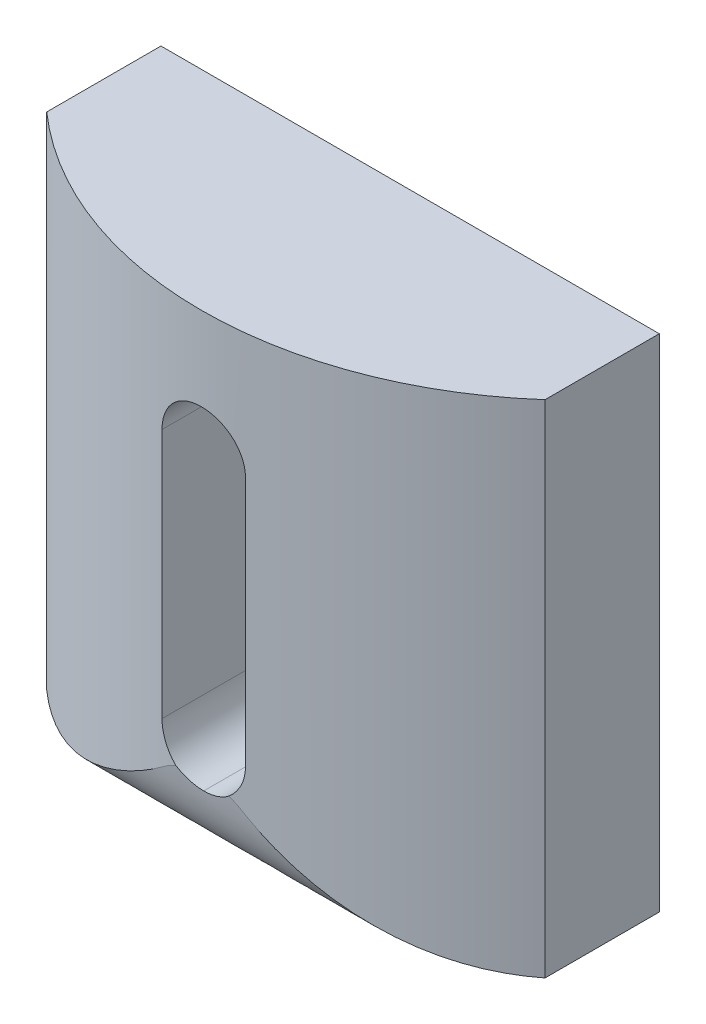
ISO-10303-21;
HEADER;
FILE_DESCRIPTION(('STEP AP214'),'2;1');
FILE_NAME('part.step','',(''),(''),'','','');
FILE_SCHEMA(('AUTOMOTIVE_DESIGN { 1 0 10303 214 1 1 1 1 }'));
ENDSEC;
DATA;
#1=APPLICATION_CONTEXT('core data for automotive mechanical design processes');
#2=APPLICATION_PROTOCOL_DEFINITION('international standard','automotive_design',2000,#1);
#3=PRODUCT_CONTEXT('',#1,'mechanical');
#4=PRODUCT('Part','Part','',(#3));
#5=PRODUCT_RELATED_PRODUCT_CATEGORY('part','',(#4));
#6=PRODUCT_DEFINITION_FORMATION('','',#4);
#7=PRODUCT_DEFINITION_CONTEXT('part definition',#1,'design');
#8=PRODUCT_DEFINITION('design','',#6,#7);
#9=PRODUCT_DEFINITION_SHAPE('','',#8);
#10=(LENGTH_UNIT() NAMED_UNIT(*) SI_UNIT(.MILLI.,.METRE.));
#11=(NAMED_UNIT(*) PLANE_ANGLE_UNIT() SI_UNIT($,.RADIAN.));
#12=(NAMED_UNIT(*) SI_UNIT($,.STERADIAN.) SOLID_ANGLE_UNIT());
#13=UNCERTAINTY_MEASURE_WITH_UNIT(LENGTH_MEASURE(1.E-05),#10,'distance_accuracy_value','');
#14=(GEOMETRIC_REPRESENTATION_CONTEXT(3) GLOBAL_UNCERTAINTY_ASSIGNED_CONTEXT((#13)) GLOBAL_UNIT_ASSIGNED_CONTEXT((#10,
#11,#12)) REPRESENTATION_CONTEXT('',''));
#15=CARTESIAN_POINT('',(0.,0.,0.));
#16=DIRECTION('',(0.,0.,1.));
#17=DIRECTION('',(1.,0.,0.));
#18=AXIS2_PLACEMENT_3D('',#15,#16,#17);
#19=CARTESIAN_POINT('',(0.,0.,12.5));
#20=DIRECTION('',(0.,1.,0.));
#21=DIRECTION('',(0.,0.,1.));
#22=AXIS2_PLACEMENT_3D('',#19,#20,#21);
#23=PLANE('',#22);
#24=DIRECTION('',(0.,0.,-1.));
#25=VECTOR('',#24,1.);
#26=CARTESIAN_POINT('',(29.85,0.,12.5));
#27=LINE('',#26,#25);
#28=CARTESIAN_POINT('',(29.85,0.,6.84257539707056));
#29=VERTEX_POINT('',#28);
#30=CARTESIAN_POINT('',(29.85,0.,0.));
#31=VERTEX_POINT('',#30);
#32=EDGE_CURVE('E129',#29,#31,#27,.T.);
#33=ORIENTED_EDGE('',*,*,#32,.F.);
#34=DIRECTION('',(1.,0.,0.));
#35=VECTOR('',#34,1.);
#36=CARTESIAN_POINT('',(0.,0.,6.84257539707056));
#37=LINE('',#36,#35);
#38=CARTESIAN_POINT('',(0.,0.,6.84257539707056));
#39=VERTEX_POINT('',#38);
#40=EDGE_CURVE('E117',#39,#29,#37,.T.);
#41=ORIENTED_EDGE('',*,*,#40,.F.);
#42=DIRECTION('',(0.,0.,-1.));
#43=VECTOR('',#42,1.);
#44=CARTESIAN_POINT('',(0.,0.,12.5));
#45=LINE('',#44,#43);
#46=CARTESIAN_POINT('',(0.,0.,0.));
#47=VERTEX_POINT('',#46);
#48=EDGE_CURVE('E127',#39,#47,#45,.T.);
#49=ORIENTED_EDGE('',*,*,#48,.T.);
#50=DIRECTION('',(1.,0.,0.));
#51=VECTOR('',#50,1.);
#52=CARTESIAN_POINT('',(0.,0.,0.));
#53=LINE('',#52,#51);
#54=EDGE_CURVE('E192',#47,#31,#53,.T.);
#55=ORIENTED_EDGE('',*,*,#54,.T.);
#56=EDGE_LOOP('',(#33,#41,#49,#55));
#57=FACE_BOUND('',#56,.T.);
#58=ADVANCED_FACE('F33',(#57),#23,.F.);
#59=CARTESIAN_POINT('',(0.,30.,12.5));
#60=DIRECTION('',(0.,-1.,0.));
#61=DIRECTION('',(0.,0.,-1.));
#62=AXIS2_PLACEMENT_3D('',#59,#60,#61);
#63=PLANE('',#62);
#64=DIRECTION('',(0.,0.,-1.));
#65=VECTOR('',#64,1.);
#66=CARTESIAN_POINT('',(0.,30.,12.5));
#67=LINE('',#66,#65);
#68=CARTESIAN_POINT('',(0.,30.,6.84257539707056));
#69=VERTEX_POINT('',#68);
#70=CARTESIAN_POINT('',(0.,30.,0.));
#71=VERTEX_POINT('',#70);
#72=EDGE_CURVE('E200',#69,#71,#67,.T.);
#73=ORIENTED_EDGE('',*,*,#72,.F.);
#74=CARTESIAN_POINT('',(14.925,30.,-10.015728977273));
#75=DIRECTION('',(0.,1.,0.));
#76=DIRECTION('',(0.,0.,1.));
#77=AXIS2_PLACEMENT_3D('',#74,#75,#76);
#78=CIRCLE('',#77,22.515728977273);
#79=CARTESIAN_POINT('',(29.85,30.,6.84257539707056));
#80=VERTEX_POINT('',#79);
#81=EDGE_CURVE('E130',#69,#80,#78,.T.);
#82=ORIENTED_EDGE('',*,*,#81,.T.);
#83=DIRECTION('',(0.,0.,-1.));
#84=VECTOR('',#83,1.);
#85=CARTESIAN_POINT('',(29.85,30.,12.5));
#86=LINE('',#85,#84);
#87=CARTESIAN_POINT('',(29.85,30.,0.));
#88=VERTEX_POINT('',#87);
#89=EDGE_CURVE('E147',#80,#88,#86,.T.);
#90=ORIENTED_EDGE('',*,*,#89,.T.);
#91=DIRECTION('',(-1.,0.,0.));
#92=VECTOR('',#91,1.);
#93=CARTESIAN_POINT('',(0.,30.,0.));
#94=LINE('',#93,#92);
#95=EDGE_CURVE('E197',#88,#71,#94,.T.);
#96=ORIENTED_EDGE('',*,*,#95,.T.);
#97=EDGE_LOOP('',(#73,#82,#90,#96));
#98=FACE_BOUND('',#97,.T.);
#99=ADVANCED_FACE('F203',(#98),#63,.F.);
#100=CARTESIAN_POINT('',(0.,0.,12.5));
#101=DIRECTION('',(1.,0.,0.));
#102=DIRECTION('',(0.,0.,-1.));
#103=AXIS2_PLACEMENT_3D('',#100,#101,#102);
#104=PLANE('',#103);
#105=ORIENTED_EDGE('',*,*,#48,.F.);
#106=DIRECTION('',(0.,-1.,0.));
#107=VECTOR('',#106,1.);
#108=CARTESIAN_POINT('',(0.,30.,6.84257539707056));
#109=LINE('',#108,#107);
#110=EDGE_CURVE('E134',#69,#39,#109,.T.);
#111=ORIENTED_EDGE('',*,*,#110,.F.);
#112=ORIENTED_EDGE('',*,*,#72,.T.);
#113=DIRECTION('',(0.,-1.,0.));
#114=VECTOR('',#113,1.);
#115=CARTESIAN_POINT('',(0.,0.,0.));
#116=LINE('',#115,#114);
#117=EDGE_CURVE('E144',#71,#47,#116,.T.);
#118=ORIENTED_EDGE('',*,*,#117,.T.);
#119=EDGE_LOOP('',(#105,#111,#112,#118));
#120=FACE_BOUND('',#119,.T.);
#121=ADVANCED_FACE('F142',(#120),#104,.F.);
#122=CARTESIAN_POINT('',(29.85,0.,12.5));
#123=DIRECTION('',(-1.,0.,0.));
#124=DIRECTION('',(0.,0.,1.));
#125=AXIS2_PLACEMENT_3D('',#122,#123,#124);
#126=PLANE('',#125);
#127=ORIENTED_EDGE('',*,*,#89,.F.);
#128=DIRECTION('',(0.,-1.,0.));
#129=VECTOR('',#128,1.);
#130=CARTESIAN_POINT('',(29.85,30.,6.84257539707056));
#131=LINE('',#130,#129);
#132=EDGE_CURVE('E139',#80,#29,#131,.T.);
#133=ORIENTED_EDGE('',*,*,#132,.T.);
#134=ORIENTED_EDGE('',*,*,#32,.T.);
#135=DIRECTION('',(0.,1.,0.));
#136=VECTOR('',#135,1.);
#137=CARTESIAN_POINT('',(29.85,0.,0.));
#138=LINE('',#137,#136);
#139=EDGE_CURVE('E194',#31,#88,#138,.T.);
#140=ORIENTED_EDGE('',*,*,#139,.T.);
#141=EDGE_LOOP('',(#127,#133,#134,#140));
#142=FACE_BOUND('',#141,.T.);
#143=ADVANCED_FACE('F207',(#142),#126,.F.);
#144=CARTESIAN_POINT('',(0.,0.,0.));
#145=DIRECTION('',(0.,0.,-1.));
#146=DIRECTION('',(-1.,0.,0.));
#147=AXIS2_PLACEMENT_3D('',#144,#145,#146);
#148=PLANE('',#147);
#149=CARTESIAN_POINT('',(14.925,22.5,0.));
#150=DIRECTION('',(0.,0.,-1.));
#151=DIRECTION('',(-1.,0.,0.));
#152=AXIS2_PLACEMENT_3D('',#149,#150,#151);
#153=CIRCLE('',#152,2.5);
#154=CARTESIAN_POINT('',(17.425,22.5,0.));
#155=VERTEX_POINT('',#154);
#156=CARTESIAN_POINT('',(14.925,25.,0.));
#157=VERTEX_POINT('',#156);
#158=EDGE_CURVE('E273',#155,#157,#153,.F.);
#159=ORIENTED_EDGE('',*,*,#158,.T.);
#160=CARTESIAN_POINT('',(14.925,22.5,0.));
#161=DIRECTION('',(0.,0.,-1.));
#162=DIRECTION('',(-1.,0.,0.));
#163=AXIS2_PLACEMENT_3D('',#160,#161,#162);
#164=CIRCLE('',#163,2.5);
#165=CARTESIAN_POINT('',(12.425,22.5,0.));
#166=VERTEX_POINT('',#165);
#167=EDGE_CURVE('E11',#157,#166,#164,.F.);
#168=ORIENTED_EDGE('',*,*,#167,.T.);
#169=DIRECTION('',(0.,-1.,0.));
#170=VECTOR('',#169,1.);
#171=CARTESIAN_POINT('',(12.425,25.,0.));
#172=LINE('',#171,#170);
#173=CARTESIAN_POINT('',(12.425,7.5,0.));
#174=VERTEX_POINT('',#173);
#175=EDGE_CURVE('E185',#166,#174,#172,.T.);
#176=ORIENTED_EDGE('',*,*,#175,.T.);
#177=CARTESIAN_POINT('',(14.925,7.5,0.));
#178=DIRECTION('',(0.,0.,-1.));
#179=DIRECTION('',(-1.,0.,0.));
#180=AXIS2_PLACEMENT_3D('',#177,#178,#179);
#181=CIRCLE('',#180,2.5);
#182=CARTESIAN_POINT('',(14.925,5.,0.));
#183=VERTEX_POINT('',#182);
#184=EDGE_CURVE('E251',#174,#183,#181,.F.);
#185=ORIENTED_EDGE('',*,*,#184,.T.);
#186=CARTESIAN_POINT('',(14.925,7.5,0.));
#187=DIRECTION('',(0.,0.,-1.));
#188=DIRECTION('',(-1.,0.,0.));
#189=AXIS2_PLACEMENT_3D('',#186,#187,#188);
#190=CIRCLE('',#189,2.5);
#191=CARTESIAN_POINT('',(17.425,7.5,0.));
#192=VERTEX_POINT('',#191);
#193=EDGE_CURVE('E265',#183,#192,#190,.F.);
#194=ORIENTED_EDGE('',*,*,#193,.T.);
#195=DIRECTION('',(0.,1.,0.));
#196=VECTOR('',#195,1.);
#197=CARTESIAN_POINT('',(17.425,25.,0.));
#198=LINE('',#197,#196);
#199=EDGE_CURVE('E188',#192,#155,#198,.T.);
#200=ORIENTED_EDGE('',*,*,#199,.T.);
#201=EDGE_LOOP('',(#159,#168,#176,#185,#194,#200));
#202=FACE_BOUND('',#201,.T.);
#203=ORIENTED_EDGE('',*,*,#117,.F.);
#204=ORIENTED_EDGE('',*,*,#95,.F.);
#205=ORIENTED_EDGE('',*,*,#139,.F.);
#206=ORIENTED_EDGE('',*,*,#54,.F.);
#207=EDGE_LOOP('',(#203,#204,#205,#206));
#208=FACE_BOUND('',#207,.T.);
#209=ADVANCED_FACE('F209',(#202,#208),#148,.T.);
#210=CARTESIAN_POINT('',(12.425,25.,0.));
#211=DIRECTION('',(-1.,0.,0.));
#212=DIRECTION('',(0.,0.,1.));
#213=AXIS2_PLACEMENT_3D('',#210,#211,#212);
#214=PLANE('',#213);
#215=DIRECTION('',(0.,-1.,0.));
#216=VECTOR('',#215,1.);
#217=CARTESIAN_POINT('',(12.425,30.,12.3607777067027));
#218=LINE('',#217,#216);
#219=CARTESIAN_POINT('',(12.425,22.5,12.3607777067027));
#220=VERTEX_POINT('',#219);
#221=CARTESIAN_POINT('',(12.425,7.5,12.3607777067027));
#222=VERTEX_POINT('',#221);
#223=EDGE_CURVE('E182',#220,#222,#218,.T.);
#224=ORIENTED_EDGE('',*,*,#223,.T.);
#225=DIRECTION('',(0.,0.,1.));
#226=VECTOR('',#225,1.);
#227=CARTESIAN_POINT('',(12.425,7.5,0.));
#228=LINE('',#227,#226);
#229=EDGE_CURVE('E295',#222,#174,#228,.F.);
#230=ORIENTED_EDGE('',*,*,#229,.T.);
#231=ORIENTED_EDGE('',*,*,#175,.F.);
#232=DIRECTION('',(0.,0.,1.));
#233=VECTOR('',#232,1.);
#234=CARTESIAN_POINT('',(12.425,22.5,12.3607777067027));
#235=LINE('',#234,#233);
#236=EDGE_CURVE('E121',#166,#220,#235,.T.);
#237=ORIENTED_EDGE('',*,*,#236,.T.);
#238=EDGE_LOOP('',(#224,#230,#231,#237));
#239=FACE_BOUND('',#238,.T.);
#240=ADVANCED_FACE('F211',(#239),#214,.F.);
#241=CARTESIAN_POINT('',(17.425,25.,0.));
#242=DIRECTION('',(1.,0.,0.));
#243=DIRECTION('',(0.,1.,0.));
#244=AXIS2_PLACEMENT_3D('',#241,#242,#243);
#245=PLANE('',#244);
#246=ORIENTED_EDGE('',*,*,#199,.F.);
#247=DIRECTION('',(0.,0.,1.));
#248=VECTOR('',#247,1.);
#249=CARTESIAN_POINT('',(17.425,7.5,12.3607777067027));
#250=LINE('',#249,#248);
#251=CARTESIAN_POINT('',(17.425,7.5,12.3607777067027));
#252=VERTEX_POINT('',#251);
#253=EDGE_CURVE('E294',#192,#252,#250,.T.);
#254=ORIENTED_EDGE('',*,*,#253,.T.);
#255=DIRECTION('',(0.,-1.,0.));
#256=VECTOR('',#255,1.);
#257=CARTESIAN_POINT('',(17.425,30.,12.3607777067027));
#258=LINE('',#257,#256);
#259=CARTESIAN_POINT('',(17.425,22.5,12.3607777067027));
#260=VERTEX_POINT('',#259);
#261=EDGE_CURVE('E179',#252,#260,#258,.F.);
#262=ORIENTED_EDGE('',*,*,#261,.T.);
#263=DIRECTION('',(0.,0.,1.));
#264=VECTOR('',#263,1.);
#265=CARTESIAN_POINT('',(17.425,22.5,0.));
#266=LINE('',#265,#264);
#267=EDGE_CURVE('E287',#260,#155,#266,.F.);
#268=ORIENTED_EDGE('',*,*,#267,.T.);
#269=EDGE_LOOP('',(#246,#254,#262,#268));
#270=FACE_BOUND('',#269,.T.);
#271=ADVANCED_FACE('F218',(#270),#245,.F.);
#272=CARTESIAN_POINT('',(14.925,30.,-10.015728977273));
#273=DIRECTION('',(0.,-1.,0.));
#274=DIRECTION('',(0.,0.,-1.));
#275=AXIS2_PLACEMENT_3D('',#272,#273,#274);
#276=CYLINDRICAL_SURFACE('',#275,22.515728977273);
#277=ORIENTED_EDGE('',*,*,#110,.T.);
#278=CARTESIAN_POINT('',(-2.58472636347347,-0.166773320827684,4.1393949732367));
#279=CARTESIAN_POINT('',(-2.45410962545879,-0.156805067942879,4.30096748757149));
#280=CARTESIAN_POINT('',(-2.32125298040341,-0.14694822163917,4.46073425650512));
#281=CARTESIAN_POINT('',(-2.05119337624261,-0.127466955344592,4.77650046362552));
#282=CARTESIAN_POINT('',(-1.91399144721932,-0.117842481207548,4.93250077945197));
#283=CARTESIAN_POINT('',(-1.63532956844886,-0.0988319903611336,5.24063630061295));
#284=CARTESIAN_POINT('',(-1.49387012052692,-0.0894459457871693,5.39277195759935));
#285=CARTESIAN_POINT('',(-1.27837860910716,-0.0755387431261878,5.61818981556341));
#286=CARTESIAN_POINT('',(-1.20590216984145,-0.0709258191980508,5.69295938779569));
#287=CARTESIAN_POINT('',(-1.05991636155013,-0.0617622835624684,5.84148840374407));
#288=CARTESIAN_POINT('',(-0.986406991421458,-0.0572116719215762,5.91524784638129));
#289=CARTESIAN_POINT('',(-0.838362618930134,-0.0481732709104207,6.06174895158061));
#290=CARTESIAN_POINT('',(-0.763827512106805,-0.0436854880339171,6.13449050893731));
#291=CARTESIAN_POINT('',(-0.613753018913467,-0.0347739290024925,6.27893433320267));
#292=CARTESIAN_POINT('',(-0.538213635548716,-0.030350152656117,6.35063660322001));
#293=CARTESIAN_POINT('',(-0.424155152816031,-0.023763126941059,6.45740674229894));
#294=CARTESIAN_POINT('',(-0.386006746453019,-0.021575332921694,6.49286989577749));
#295=CARTESIAN_POINT('',(-0.309464222663843,-0.0172155275645243,6.56353108293002));
#296=CARTESIAN_POINT('',(-0.271070105426475,-0.0150435162145955,6.59872911680767));
#297=CARTESIAN_POINT('',(-0.194037643789323,-0.010718126564865,6.66885867571665));
#298=CARTESIAN_POINT('',(-0.15539929756492,-0.00856474840455604,6.7037901987526));
#299=CARTESIAN_POINT('',(-0.0972604915295719,-0.00534097706670996,6.7559858844427));
#300=CARTESIAN_POINT('',(-0.0778506433359544,-0.00426743419607127,6.7733508746218));
#301=CARTESIAN_POINT('',(-0.0389703205852642,-0.00213567207549544,6.80801382571111));
#302=CARTESIAN_POINT('',(-0.019499845995766,-0.00107745283375576,6.82531178658545));
#303=CARTESIAN_POINT('',(0.0180680442623334,0.000998339448172658,6.85857140434365));
#304=CARTESIAN_POINT('',(0.0361613050166557,0.00201319168141877,6.87453792047468));
#305=CARTESIAN_POINT('',(0.0723963072505063,0.00412586844651311,6.90641028321091));
#306=CARTESIAN_POINT('',(0.0905380486581804,0.00522369285545239,6.92231612990595));
#307=CARTESIAN_POINT('',(0.145035856645974,0.00862339209468691,6.9699426130187));
#308=CARTESIAN_POINT('',(0.181464776237177,0.0110315077130629,7.00157243083197));
#309=CARTESIAN_POINT('',(0.254512494736611,0.0161412888347708,7.06458642882731));
#310=CARTESIAN_POINT('',(0.291131289255312,0.0188429475805306,7.09597061464618));
#311=CARTESIAN_POINT('',(0.364556699359893,0.0245379562649379,7.15849203524776));
#312=CARTESIAN_POINT('',(0.401363315971417,0.027531307798056,7.18962926867955));
#313=CARTESIAN_POINT('',(0.512041505479065,0.0369491787811233,7.2826514950309));
#314=CARTESIAN_POINT('',(0.586190385191508,0.0438128407255969,7.34416337531421));
#315=CARTESIAN_POINT('',(0.73520169571206,0.0587150050329768,7.46617448652288));
#316=CARTESIAN_POINT('',(0.810064142054956,0.0667535330283031,7.52667369532235));
#317=CARTESIAN_POINT('',(0.960463454472547,0.0840073229129021,7.64663273018456));
#318=CARTESIAN_POINT('',(1.03600020869519,0.0932223928946934,7.70609272396096));
#319=CARTESIAN_POINT('',(1.18773133227829,0.112832155756057,7.82396639461329));
#320=CARTESIAN_POINT('',(1.26392569500386,0.123226836746866,7.88238008202761));
#321=CARTESIAN_POINT('',(1.49344735642436,0.156181641879347,8.05602387518693));
#322=CARTESIAN_POINT('',(1.64772793533411,0.180514213459288,8.16966843966551));
#323=CARTESIAN_POINT('',(1.95851582504007,0.233890846508653,8.39255426177924));
#324=CARTESIAN_POINT('',(2.11502202408954,0.262932626167091,8.5017976201392));
#325=CARTESIAN_POINT('',(2.43015834690951,0.325731004607929,8.7158827919752));
#326=CARTESIAN_POINT('',(2.58878910576317,0.359489042981351,8.820723248753));
#327=CARTESIAN_POINT('',(2.90793113306912,0.43169218395995,9.0259123388558));
#328=CARTESIAN_POINT('',(3.06844282291947,0.470138355755566,9.12625994036518));
#329=CARTESIAN_POINT('',(3.39109648381558,0.551673524066099,9.32238805699535));
#330=CARTESIAN_POINT('',(3.55323866403019,0.594763123337911,9.41816797685824));
#331=CARTESIAN_POINT('',(3.91110125345408,0.694501023057601,9.62358489874503));
#332=CARTESIAN_POINT('',(4.10712205370183,0.752145635092225,9.73221734820239));
#333=CARTESIAN_POINT('',(4.5007281344738,0.873890849470155,9.94278861540799));
#334=CARTESIAN_POINT('',(4.69831333093838,0.937991107072695,10.044727790107));
#335=CARTESIAN_POINT('',(5.09465532036718,1.07250878717622,10.2418957944017));
#336=CARTESIAN_POINT('',(5.29341202082371,1.14292571696363,10.3371251463447));
#337=CARTESIAN_POINT('',(5.69169649073698,1.28991491512458,10.5208785566397));
#338=CARTESIAN_POINT('',(5.89122411547407,1.36648607701522,10.6094038148013));
#339=CARTESIAN_POINT('',(6.29045303368255,1.52552416984341,10.7796956053758));
#340=CARTESIAN_POINT('',(6.49015373846146,1.60798308274544,10.8614710143734));
#341=CARTESIAN_POINT('',(6.88965187680597,1.77872027039568,11.0184644992205));
#342=CARTESIAN_POINT('',(7.08944931346688,1.86699874552389,11.0936823490717));
#343=CARTESIAN_POINT('',(7.4888446115931,2.04922331448201,11.2376641252193));
#344=CARTESIAN_POINT('',(7.68844241459959,2.14317074537623,11.3064265190984));
#345=CARTESIAN_POINT('',(8.08714270863749,2.33658693477774,11.4376114485872));
#346=CARTESIAN_POINT('',(8.2862449977385,2.43605764956445,11.5000317154551));
#347=CARTESIAN_POINT('',(8.62039839316594,2.60786406429057,11.5997758574368));
#348=CARTESIAN_POINT('',(8.7556893157424,2.67877303249714,11.6387694953954));
#349=CARTESIAN_POINT('',(9.02574719268075,2.82303062088067,11.7138938476289));
#350=CARTESIAN_POINT('',(9.16051419924011,2.89637899068291,11.7500248544382));
#351=CARTESIAN_POINT('',(9.42938938643479,3.04546597334375,11.8194625277183));
#352=CARTESIAN_POINT('',(9.56349777297239,3.121203775867,11.8527701378637));
#353=CARTESIAN_POINT('',(9.83091679975785,3.27503107554338,11.9166045354289));
#354=CARTESIAN_POINT('',(9.96422786110896,3.35311916982887,11.9471329395874));
#355=CARTESIAN_POINT('',(10.2299031644803,3.51162390568147,12.0054562124617));
#356=CARTESIAN_POINT('',(10.3622681118056,3.59203852240242,12.0332533708158));
#357=CARTESIAN_POINT('',(10.6260802252436,3.75531867026217,12.0862041274237));
#358=CARTESIAN_POINT('',(10.7575270367019,3.83818509005702,12.1113567517454));
#359=CARTESIAN_POINT('',(11.0192919642689,4.00641096730091,12.1590583248697));
#360=CARTESIAN_POINT('',(11.1496101055654,4.09177036892868,12.1816073319148));
#361=CARTESIAN_POINT('',(11.3441066343877,4.22180454260657,12.2135214570234));
#362=CARTESIAN_POINT('',(11.4087905924286,4.26549238026185,12.2238434898755));
#363=CARTESIAN_POINT('',(11.5377889656856,4.35355790585421,12.2438557578735));
#364=CARTESIAN_POINT('',(11.6021033705891,4.39793561291555,12.2535459754657));
#365=CARTESIAN_POINT('',(11.7303863402542,4.48746352995986,12.2723104543757));
#366=CARTESIAN_POINT('',(11.7943544626274,4.53261451389816,12.2813840472309));
#367=CARTESIAN_POINT('',(11.9218186312122,4.62368906378223,12.2989095105476));
#368=CARTESIAN_POINT('',(11.9853147081834,4.6696125787403,12.3073614218443));
#369=CARTESIAN_POINT('',(12.0802131528461,4.73917273608251,12.3195851974895));
#370=CARTESIAN_POINT('',(12.1118175270517,4.76249389480834,12.3235876106331));
#371=CARTESIAN_POINT('',(12.1748804803158,4.80935713004554,12.3314387052446));
#372=CARTESIAN_POINT('',(12.2063390620472,4.83289920248257,12.3352873895409));
#373=CARTESIAN_POINT('',(12.2690981630329,4.88022318365276,12.3428317115121));
#374=CARTESIAN_POINT('',(12.3003986681798,4.90400511324324,12.3465273357321));
#375=CARTESIAN_POINT('',(12.3472272000787,4.93985552408306,12.3519572123523));
#376=CARTESIAN_POINT('',(12.3628165177557,4.95183538545921,12.3537482644889));
#377=CARTESIAN_POINT('',(12.393936775159,4.97587663302867,12.3572908446724));
#378=CARTESIAN_POINT('',(12.4094677145269,4.98793801972132,12.3590423724771));
#379=CARTESIAN_POINT('',(12.4321523597471,5.00555434178477,12.3615767993208));
#380=CARTESIAN_POINT('',(12.439305004929,5.01110880943647,12.362372458172));
#381=CARTESIAN_POINT('',(12.4536401156537,5.02217959364444,12.363960109549));
#382=CARTESIAN_POINT('',(12.4608225810018,5.02769591044898,12.3647521020988));
#383=CARTESIAN_POINT('',(12.4824038450954,5.0442008395671,12.3671212658894));
#384=CARTESIAN_POINT('',(12.4968368675489,5.05514570722479,12.3686916630143));
#385=CARTESIAN_POINT('',(12.5257990305189,5.0769070965024,12.3718143927379));
#386=CARTESIAN_POINT('',(12.5403281611926,5.08772363095775,12.3733667271428));
#387=CARTESIAN_POINT('',(12.5694834854834,5.10922830930857,12.3764528781024));
#388=CARTESIAN_POINT('',(12.5841096811434,5.11991645048822,12.3779866942654));
#389=CARTESIAN_POINT('',(12.6280749999095,5.15173869911663,12.3825534142431));
#390=CARTESIAN_POINT('',(12.6575604082916,5.1726754073136,12.3855580150347));
#391=CARTESIAN_POINT('',(12.7169282593843,5.21399506996568,12.3914877303454));
#392=CARTESIAN_POINT('',(12.7468107360831,5.23437797655609,12.3944128379941));
#393=CARTESIAN_POINT('',(12.8069182744244,5.27452082859793,12.4001736582057));
#394=CARTESIAN_POINT('',(12.8371425837336,5.29428187636388,12.4030095289505));
#395=CARTESIAN_POINT('',(12.897990206733,5.33318887734258,12.4085929981427));
#396=CARTESIAN_POINT('',(12.9286135043865,5.35233485517062,12.4113406001226));
#397=CARTESIAN_POINT('',(13.0210064073616,5.40875368521015,12.4194371568479));
#398=CARTESIAN_POINT('',(13.0833817888672,5.44506289191725,12.4246478210388));
#399=CARTESIAN_POINT('',(13.2095352554624,5.51471495595898,12.4346434541133));
#400=CARTESIAN_POINT('',(13.2733080950354,5.54806711249651,12.4394297575084));
#401=CARTESIAN_POINT('',(13.4025886693169,5.61172703771231,12.4485654701535));
#402=CARTESIAN_POINT('',(13.4681003214081,5.64202703517475,12.4529137641716));
#403=CARTESIAN_POINT('',(13.6010317983456,5.69934607246809,12.4611395083104));
#404=CARTESIAN_POINT('',(13.6684604883864,5.72634505837608,12.4650140805314));
#405=CARTESIAN_POINT('',(13.805407367659,5.77678539729607,12.4722526759604));
#406=CARTESIAN_POINT('',(13.8749395020636,5.80018958888963,12.4756113662053));
#407=CARTESIAN_POINT('',(13.9451398298271,5.82149363070567,12.478668668028));
#408=B_SPLINE_CURVE_WITH_KNOTS('',3,(#278,#279,#280,#281,#282,#283,#284,#285,#286,#287,#288,
#289,#290,#291,#292,#293,#294,#295,#296,#297,#298,#299,#300,#301,#302,#303,#304,#305,#306,#307,
#308,#309,#310,#311,#312,#313,#314,#315,#316,#317,#318,#319,#320,#321,#322,#323,#324,#325,#326,
#327,#328,#329,#330,#331,#332,#333,#334,#335,#336,#337,#338,#339,#340,#341,#342,#343,#344,#345,
#346,#347,#348,#349,#350,#351,#352,#353,#354,#355,#356,#357,#358,#359,#360,#361,#362,#363,#364,
#365,#366,#367,#368,#369,#370,#371,#372,#373,#374,#375,#376,#377,#378,#379,#380,#381,#382,#383,
#384,#385,#386,#387,#388,#389,#390,#391,#392,#393,#394,#395,#396,#397,#398,#399,#400,#401,#402,
#403,#404,#405,#406,#407),.UNSPECIFIED.,.F.,.F.,(4,2,2,2,2,2,2,2,2,2,2,2,2,2,2,2,2,2,2,2,2,2,2,
2,2,2,2,2,2,2,2,2,2,2,2,2,2,2,2,2,2,2,2,2,2,2,2,2,2,2,2,2,2,2,2,2,2,2,2,2,2,2,2,2,4),(0.,
0.623990027760338,1.24783322518938,1.87160317723592,2.18429518380998,2.49698752433141,
2.80971194851714,3.12243543709736,3.27882975067016,3.43522394408929,3.59161930730321,
3.66981724340471,3.74801522133704,3.82047141031475,3.89292749196323,4.0378385755848,
4.18274632395633,4.32765486447669,4.61739670424131,4.90714486633814,5.19684582742349,
5.48654386900357,6.0658833263003,6.6449429033167,7.22417962025854,7.80354868768732,
8.38299305301323,9.07700591678245,9.77098173889746,10.4649034764471,11.1587007301813,
11.8515705457502,12.5444642307847,13.2375219834803,13.930826794254,14.403722292389,
14.8765694024792,15.3492578427648,15.8216695265358,16.2936817408057,16.7658671838397,
17.2380420620912,17.4742415981051,17.710447693657,17.9469058971732,18.1833485550037,
18.301789940601,18.4202291460564,18.5386787410195,18.5979048964455,18.6571314149586,
18.6844042440416,18.7116768954784,18.7662208414077,18.8207592852588,18.8752988806952,
18.9841537498224,19.0930179974679,19.201676944743,19.3103315380233,19.5273411186921,
19.743642072713,19.9604805315688,20.1785769565382,20.3987949030228),.UNSPECIFIED.);
#409=CARTESIAN_POINT('',(13.3291959858264,5.57557552802213,12.4433774369715));
#410=VERTEX_POINT('',#409);
#411=EDGE_CURVE('E59',#39,#410,#408,.T.);
#412=ORIENTED_EDGE('',*,*,#411,.T.);
#413=CARTESIAN_POINT('',(13.3291959858264,5.57557552802212,12.4433774369715));
#414=CARTESIAN_POINT('',(13.2750731652166,5.62044782168111,12.4395322863157));
#415=CARTESIAN_POINT('',(13.2228566217285,5.66760869917295,12.4356249680018));
#416=CARTESIAN_POINT('',(13.1225792025509,5.76615660040246,12.4277969130826));
#417=CARTESIAN_POINT('',(13.074518261255,5.81754355739608,12.4238761766902));
#418=CARTESIAN_POINT('',(12.9828985740779,5.92418804679255,12.4161325090518));
#419=CARTESIAN_POINT('',(12.9393393231884,5.97944514386626,12.4123095668714));
#420=CARTESIAN_POINT('',(12.8570330294392,6.09342265959322,12.4048702328092));
#421=CARTESIAN_POINT('',(12.8182858126551,6.15214295296078,12.4012538334647));
#422=CARTESIAN_POINT('',(12.709630682636,6.33299999129772,12.3908662453807));
#423=CARTESIAN_POINT('',(12.6473045817126,6.45983838381307,12.3845562522219));
#424=CARTESIAN_POINT('',(12.5449440892848,6.72209875370461,12.3739127635545));
#425=CARTESIAN_POINT('',(12.5048829610115,6.85751021743539,12.3695768985617));
#426=CARTESIAN_POINT('',(12.4593696215272,7.07826266576637,12.3645972873945));
#427=CARTESIAN_POINT('',(12.446490637931,7.16211837419539,12.3631710500484));
#428=CARTESIAN_POINT('',(12.4293055616254,7.3306375580559,12.3612589002607));
#429=CARTESIAN_POINT('',(12.4249917483744,7.41530023685,12.3607721409957));
#430=CARTESIAN_POINT('',(12.425,7.5,12.3607777067027));
#431=B_SPLINE_CURVE_WITH_KNOTS('',3,(#413,#414,#415,#416,#417,#418,#419,#420,#421,#422,#423,
#424,#425,#426,#427,#428,#429,#430),.UNSPECIFIED.,.F.,.F.,(4,2,2,2,2,2,2,2,4),(0.,
0.211162098629584,0.422320862938043,0.633455913275937,0.844583330204255,1.26681670934957,
1.68854195025332,1.94268683781393,2.19660253803843),.UNSPECIFIED.);
#432=EDGE_CURVE('E245',#410,#222,#431,.T.);
#433=ORIENTED_EDGE('',*,*,#432,.T.);
#434=ORIENTED_EDGE('',*,*,#223,.F.);
#435=CARTESIAN_POINT('',(12.425,22.5,12.3607777067027));
#436=CARTESIAN_POINT('',(12.4249930098564,22.570086213212,12.3607744610579));
#437=CARTESIAN_POINT('',(12.4279472028724,22.6401689382476,12.3611069170635));
#438=CARTESIAN_POINT('',(12.4397238237075,22.7798286830407,12.3624192477107));
#439=CARTESIAN_POINT('',(12.4485458354313,22.8494057383023,12.363399076446));
#440=CARTESIAN_POINT('',(12.4719921214409,22.987495671886,12.365980868804));
#441=CARTESIAN_POINT('',(12.4866105221571,23.0560095547312,12.3675822026113));
#442=CARTESIAN_POINT('',(12.5215276801244,23.1915377717028,12.3713583204717));
#443=CARTESIAN_POINT('',(12.5418263957475,23.2585521168147,12.3735331003224));
#444=CARTESIAN_POINT('',(12.6110677815176,23.456687047323,12.3808323202869));
#445=CARTESIAN_POINT('',(12.6683679344739,23.5849712036945,12.3867330749389));
#446=CARTESIAN_POINT('',(12.8035261275409,23.8300212168028,12.3999347001015));
#447=CARTESIAN_POINT('',(12.8813825121106,23.9467880000766,12.4072354578469));
#448=CARTESIAN_POINT('',(13.0558228256012,24.1660946073572,12.4224506145685));
#449=CARTESIAN_POINT('',(13.1524774719161,24.2685781183657,12.4303672607863));
#450=CARTESIAN_POINT('',(13.3616340689671,24.4559148927435,12.4459030025947));
#451=CARTESIAN_POINT('',(13.4741390643599,24.5407647611387,12.4535220406585));
#452=CARTESIAN_POINT('',(13.7121648386375,24.6906325599802,12.4676275893509));
#453=CARTESIAN_POINT('',(13.8377214271783,24.7555938898784,12.4741108456784));
#454=CARTESIAN_POINT('',(14.0980191599651,24.863454814295,12.4851837665857));
#455=CARTESIAN_POINT('',(14.2327545512954,24.9063680861866,12.4897746047648));
#456=CARTESIAN_POINT('',(14.4610811630845,24.9583543749797,12.4954045812207));
#457=CARTESIAN_POINT('',(14.5532215476086,24.9739593865647,12.4971193999663));
#458=CARTESIAN_POINT('',(14.7385611928947,24.9947822521097,12.499420588881));
#459=CARTESIAN_POINT('',(14.8317589289535,25.0000135227894,12.5000084165941));
#460=CARTESIAN_POINT('',(14.925,25.,12.5));
#461=B_SPLINE_CURVE_WITH_KNOTS('',3,(#435,#436,#437,#438,#439,#440,#441,#442,#443,#444,#445,
#446,#447,#448,#449,#450,#451,#452,#453,#454,#455,#456,#457,#458,#459,#460),.UNSPECIFIED.,.F.,
.F.,(4,2,2,2,2,2,2,2,2,2,2,2,4),(0.,0.210189393780704,0.420363884321427,0.630325943887181,
0.840286464796636,1.25999206933071,1.67966388226638,2.10094611605048,2.52230938357243,
2.9448608897643,3.36714995134481,3.64700307289951,3.92649401401219),.UNSPECIFIED.);
#462=CARTESIAN_POINT('',(14.925,25.,12.5));
#463=VERTEX_POINT('',#462);
#464=EDGE_CURVE('E43',#220,#463,#461,.T.);
#465=ORIENTED_EDGE('',*,*,#464,.T.);
#466=CARTESIAN_POINT('',(14.925,25.,12.5));
#467=CARTESIAN_POINT('',(14.9950875626848,25.0000069869018,12.5000031673256));
#468=CARTESIAN_POINT('',(15.0651716446866,24.9970526833141,12.4996728113538));
#469=CARTESIAN_POINT('',(15.2048341792079,24.9852755986394,12.4983684609991));
#470=CARTESIAN_POINT('',(15.2744126669805,24.9764532307556,12.4973945119351));
#471=CARTESIAN_POINT('',(15.4125057347669,24.9530059276009,12.494827671498));
#472=CARTESIAN_POINT('',(15.4810213162988,24.9383868489915,12.4932354048707));
#473=CARTESIAN_POINT('',(15.6165529503856,24.9034680072597,12.4894795637985));
#474=CARTESIAN_POINT('',(15.6835690141084,24.8831682864598,12.48731599361));
#475=CARTESIAN_POINT('',(15.8817093579611,24.8139232510944,12.4800517337919));
#476=CARTESIAN_POINT('',(16.0099971462707,24.7566198742052,12.4741760772974));
#477=CARTESIAN_POINT('',(16.2550531257041,24.6214541520213,12.4610173644626));
#478=CARTESIAN_POINT('',(16.3718222599492,24.5435934918326,12.4537344234923));
#479=CARTESIAN_POINT('',(16.591126069476,24.3691488826292,12.4385403078681));
#480=CARTESIAN_POINT('',(16.6936051887496,24.2724951745547,12.4306268594699));
#481=CARTESIAN_POINT('',(16.8809335318215,24.0633422496099,12.4150810595973));
#482=CARTESIAN_POINT('',(16.9657793393797,23.9508399693415,12.4074487628279));
#483=CARTESIAN_POINT('',(17.1156429069162,23.7128165333845,12.3933057134717));
#484=CARTESIAN_POINT('',(17.180603315413,23.5872590948485,12.3867982280201));
#485=CARTESIAN_POINT('',(17.2884622569284,23.3269596151478,12.3756768745504));
#486=CARTESIAN_POINT('',(17.3313744969754,23.1922233394932,12.3710618303901));
#487=CARTESIAN_POINT('',(17.3833578440613,22.9638995862425,12.3654006223455));
#488=CARTESIAN_POINT('',(17.3989615263408,22.8717631830385,12.3636757214512));
#489=CARTESIAN_POINT('',(17.4197826718924,22.6864312931004,12.3613606774379));
#490=CARTESIAN_POINT('',(17.4250135290308,22.5932373286173,12.3607690709909));
#491=CARTESIAN_POINT('',(17.425,22.5,12.3607777067027));
#492=B_SPLINE_CURVE_WITH_KNOTS('',3,(#466,#467,#468,#469,#470,#471,#472,#473,#474,#475,#476,
#477,#478,#479,#480,#481,#482,#483,#484,#485,#486,#487,#488,#489,#490,#491),.UNSPECIFIED.,.F.,
.F.,(4,2,2,2,2,2,2,2,2,2,2,2,4),(0.,0.210193460542016,0.420372121752083,0.630338969470285,
0.840304252907914,1.26002034581525,1.67970204474633,2.10097239769459,2.52232429073533,
2.94488019771266,3.36717308894693,3.6470143296891,3.92649399071756),.UNSPECIFIED.);
#493=EDGE_CURVE('E267',#463,#260,#492,.T.);
#494=ORIENTED_EDGE('',*,*,#493,.T.);
#495=ORIENTED_EDGE('',*,*,#261,.F.);
#496=CARTESIAN_POINT('',(17.425,7.5,12.3607777067027));
#497=CARTESIAN_POINT('',(17.4250070573413,7.4299271754576,12.360774457622));
#498=CARTESIAN_POINT('',(17.4220539535097,7.35985773388066,12.3611067890214));
#499=CARTESIAN_POINT('',(17.4102816165519,7.2202229069205,12.3624186414049));
#500=CARTESIAN_POINT('',(17.401462684899,7.15065749581845,12.3633981291285));
#501=CARTESIAN_POINT('',(17.3780204937228,7.01256559641803,12.3659794884283));
#502=CARTESIAN_POINT('',(17.3634010095251,6.94403846240915,12.3675809551714));
#503=CARTESIAN_POINT('',(17.3284789620601,6.80848474805682,12.3713576024312));
#504=CARTESIAN_POINT('',(17.3081765595155,6.74145812533426,12.3735327667228));
#505=CARTESIAN_POINT('',(17.2389147110259,6.54325928457942,12.3808342099885));
#506=CARTESIAN_POINT('',(17.1815943723575,6.41493149940561,12.3867371715713));
#507=CARTESIAN_POINT('',(17.0463973113247,6.16986896094546,12.3999417651614));
#508=CARTESIAN_POINT('',(16.9685396028249,6.05312362129422,12.4072421017475));
#509=CARTESIAN_POINT('',(16.8279439008655,5.87635108805245,12.4195054813418));
#510=CARTESIAN_POINT('',(16.7708580936583,5.81174240323309,12.4242912076578));
#511=CARTESIAN_POINT('',(16.6504041367223,5.68881677363904,12.4338742666167));
#512=CARTESIAN_POINT('',(16.5870430470601,5.63049290897157,12.4386715804234));
#513=CARTESIAN_POINT('',(16.5208040141736,5.57557552802212,12.4433774369715));
#514=B_SPLINE_CURVE_WITH_KNOTS('',3,(#496,#497,#498,#499,#500,#501,#502,#503,#504,#505,#506,
#507,#508,#509,#510,#511,#512,#513),.UNSPECIFIED.,.F.,.F.,(4,2,2,2,2,2,2,2,4),(0.,
0.210149473897073,0.420288148022831,0.6302902758607,0.840286465083066,1.26016886160512,
1.67966387961581,1.93828360607473,2.19661560566572),.UNSPECIFIED.);
#515=CARTESIAN_POINT('',(16.5208040141736,5.57557552802214,12.4433774369715));
#516=VERTEX_POINT('',#515);
#517=EDGE_CURVE('E253',#252,#516,#514,.T.);
#518=ORIENTED_EDGE('',*,*,#517,.T.);
#519=CARTESIAN_POINT('',(15.9048601701728,5.82149363070568,12.478668668028));
#520=CARTESIAN_POINT('',(15.9750194644923,5.80020203339274,12.4756131520914));
#521=CARTESIAN_POINT('',(16.0445113646463,5.77681274493028,12.4722566005663));
#522=CARTESIAN_POINT('',(16.1813489841731,5.72641778368146,12.4650245171994));
#523=CARTESIAN_POINT('',(16.2487092789215,5.69945095534027,12.4611545598489));
#524=CARTESIAN_POINT('',(16.3814871952444,5.64221158795064,12.4529402489829));
#525=CARTESIAN_POINT('',(16.4469141334703,5.61196012918477,12.448598920658));
#526=CARTESIAN_POINT('',(16.5760194233313,5.54840985421035,12.4394789437101));
#527=CARTESIAN_POINT('',(16.6397019358338,5.5151192952342,12.4347014800663));
#528=CARTESIAN_POINT('',(16.7658345108269,5.44551228517645,12.4247123125896));
#529=CARTESIAN_POINT('',(16.8282753952726,5.40917955478492,12.4194982725428));
#530=CARTESIAN_POINT('',(16.9207663397177,5.35271980107354,12.4113958429761));
#531=CARTESIAN_POINT('',(16.951423325367,5.33355854650839,12.4086460486834));
#532=CARTESIAN_POINT('',(17.0123376097303,5.29461948214189,12.4030579780684));
#533=CARTESIAN_POINT('',(17.0425948909248,5.27484164544194,12.4002196978859));
#534=CARTESIAN_POINT('',(17.1027718326646,5.23466101795138,12.3944534568418));
#535=CARTESIAN_POINT('',(17.1326906831041,5.2142570399488,12.3915253256163));
#536=CARTESIAN_POINT('',(17.1921301066282,5.1728940138425,12.3855893863692));
#537=CARTESIAN_POINT('',(17.2216507170379,5.15193501831119,12.3825815858939));
#538=CARTESIAN_POINT('',(17.2656711886641,5.12007614886282,12.3780096131426));
#539=CARTESIAN_POINT('',(17.2803176648353,5.10937413847952,12.3764738082685));
#540=CARTESIAN_POINT('',(17.3095132799294,5.08784141744451,12.3733836279498));
#541=CARTESIAN_POINT('',(17.3240624211089,5.07701070979285,12.3718292529381));
#542=CARTESIAN_POINT('',(17.3530644053178,5.05522036040848,12.3687023854931));
#543=CARTESIAN_POINT('',(17.3675172373378,5.04426070431837,12.3671298910428));
#544=CARTESIAN_POINT('',(17.3891283373869,5.0277337075062,12.3647575092409));
#545=CARTESIAN_POINT('',(17.3963207789315,5.02221004571698,12.3639644308313));
#546=CARTESIAN_POINT('',(17.4106752420292,5.01112378133218,12.3623746555964));
#547=CARTESIAN_POINT('',(17.4178372633559,5.00556117844763,12.3615779587443));
#548=CARTESIAN_POINT('',(17.4457900756952,4.98385849897536,12.3584549491668));
#549=CARTESIAN_POINT('',(17.4665861777214,4.96772899839691,12.3561022402453));
#550=CARTESIAN_POINT('',(17.5082772409765,4.93560900453851,12.3513264750641));
#551=CARTESIAN_POINT('',(17.5291722014581,4.91961851021029,12.3489034193355));
#552=CARTESIAN_POINT('',(17.5919633648433,4.87180471120038,12.3415323727311));
#553=CARTESIAN_POINT('',(17.6339670438489,4.8401381628948,12.3364823691019));
#554=CARTESIAN_POINT('',(17.7182416053389,4.77721763091516,12.3261074399299));
#555=CARTESIAN_POINT('',(17.7605124598005,4.74596360500159,12.3207825428129));
#556=CARTESIAN_POINT('',(17.8452959333369,4.6838323526476,12.3098561311421));
#557=CARTESIAN_POINT('',(17.8878085582544,4.65295513537046,12.3042546098779));
#558=CARTESIAN_POINT('',(18.0154925569474,4.56099152065231,12.2870572188228));
#559=CARTESIAN_POINT('',(18.1009923361144,4.50043742267393,12.2750461184149));
#560=CARTESIAN_POINT('',(18.2727378870111,4.38062164799143,12.2499000625636));
#561=CARTESIAN_POINT('',(18.3589837197954,4.32136007848834,12.2367650143426));
#562=CARTESIAN_POINT('',(18.5320185568928,4.20411883137741,12.2093724299841));
#563=CARTESIAN_POINT('',(18.6188068238093,4.14613775999289,12.195116200041));
#564=CARTESIAN_POINT('',(18.7929455449076,4.03133321750897,12.1654533574138));
#565=CARTESIAN_POINT('',(18.8802959787369,3.97450970480866,12.1500467861644));
#566=CARTESIAN_POINT('',(19.055461598007,3.8620063123739,12.1180746018193));
#567=CARTESIAN_POINT('',(19.143276550611,3.80632591745599,12.1015095263644));
#568=CARTESIAN_POINT('',(19.3193609876941,3.69605797179123,12.067198583776));
#569=CARTESIAN_POINT('',(19.4076304777838,3.64147043457506,12.0494527020347));
#570=CARTESIAN_POINT('',(19.6730668562805,3.47931625141639,11.9944179639752));
#571=CARTESIAN_POINT('',(19.8508537890443,3.3733630762779,11.9553334458816));
#572=CARTESIAN_POINT('',(20.2073551755116,3.16597441218611,11.8723544577454));
#573=CARTESIAN_POINT('',(20.3860665210252,3.06452901381377,11.8284713555103));
#574=CARTESIAN_POINT('',(20.7447555376553,2.86582938710481,11.7356583018278));
#575=CARTESIAN_POINT('',(20.9247343029449,2.76857948314309,11.6867233115792));
#576=CARTESIAN_POINT('',(21.2856508154489,2.57839749155205,11.5837018944472));
#577=CARTESIAN_POINT('',(21.4665890921336,2.48546814303135,11.5296122641816));
#578=CARTESIAN_POINT('',(21.829130724545,2.30406727659777,11.4161891648808));
#579=CARTESIAN_POINT('',(22.0107342619869,2.2155970920476,11.3568541418226));
#580=CARTESIAN_POINT('',(22.3743144983852,2.04326088565493,11.2328629583598));
#581=CARTESIAN_POINT('',(22.556291207626,1.95939499251975,11.1682066493313));
#582=CARTESIAN_POINT('',(22.968071303326,1.77503817551767,11.0158437832565));
#583=CARTESIAN_POINT('',(23.1979135519412,1.67594845182265,10.9265363558037));
#584=CARTESIAN_POINT('',(23.6571766370286,1.48560710503997,10.739237170722));
#585=CARTESIAN_POINT('',(23.8865976093851,1.39435222656128,10.6412490546569));
#586=CARTESIAN_POINT('',(24.3445225652009,1.2199066450385,10.436496663989));
#587=CARTESIAN_POINT('',(24.5730267463473,1.13671410277506,10.3297344013059));
#588=CARTESIAN_POINT('',(25.0286215402562,0.978601082946799,10.1073706959124));
#589=CARTESIAN_POINT('',(25.2557120327374,0.903681300418274,9.99176851189432));
#590=CARTESIAN_POINT('',(25.7081109128134,0.762258949378418,9.75162345416526));
#591=CARTESIAN_POINT('',(25.9334171675384,0.695765344383751,9.62707127672688));
#592=CARTESIAN_POINT('',(26.3814437766254,0.571454364933337,9.36918179913122));
#593=CARTESIAN_POINT('',(26.6041636360911,0.513638626512677,9.23584284920859));
#594=CARTESIAN_POINT('',(27.0463163654633,0.406846520457512,8.96056020374709));
#595=CARTESIAN_POINT('',(27.2657498738113,0.357868414956406,8.8186182072947));
#596=CARTESIAN_POINT('',(27.7006670341304,0.268849342069651,8.52635768690156));
#597=CARTESIAN_POINT('',(27.9161526668215,0.228803773728169,8.37604352537564));
#598=CARTESIAN_POINT('',(28.2282776677981,0.17674061346057,8.15005661654159));
#599=CARTESIAN_POINT('',(28.3266746379815,0.1612097200612,8.07758836389834));
#600=CARTESIAN_POINT('',(28.5224299223253,0.132074183671824,7.93093923173125));
#601=CARTESIAN_POINT('',(28.6197885357424,0.118468971020636,7.85675886627441));
#602=CARTESIAN_POINT('',(28.81341796587,0.093180292135747,7.70671153423552));
#603=CARTESIAN_POINT('',(28.9096889904187,0.0814964527375911,7.63084489841366));
#604=CARTESIAN_POINT('',(29.1009910246644,0.0600552591861186,7.47753645550887));
#605=CARTESIAN_POINT('',(29.1960234175255,0.0502955463307241,7.40009670698082));
#606=CARTESIAN_POINT('',(29.3376954274859,0.037082426973373,7.28271095860451));
#607=CARTESIAN_POINT('',(29.384776474001,0.0329155630396962,7.24337533239039));
#608=CARTESIAN_POINT('',(29.4786381256693,0.0250551932542004,7.16430112117102));
#609=CARTESIAN_POINT('',(29.5254187344851,0.0213616816211497,7.1245625410936));
#610=CARTESIAN_POINT('',(29.6186823199462,0.0144511003112491,7.04467904289236));
#611=CARTESIAN_POINT('',(29.6651652395617,0.0112341194589422,7.00453405050009));
#612=CARTESIAN_POINT('',(29.7346547294874,0.00675138655423371,6.94402106957808));
#613=CARTESIAN_POINT('',(29.7577789591263,0.00531425350946963,6.92380063724484));
#614=CARTESIAN_POINT('',(29.8039491483256,0.00257807348965007,6.88326115096528));
#615=CARTESIAN_POINT('',(29.8269951075514,0.00127902710413661,6.86294209659829));
#616=CARTESIAN_POINT('',(29.8889137919518,-0.00216353085510746,6.808124225002));
#617=CARTESIAN_POINT('',(29.9277100786422,-0.00426978010567964,6.77353672480035));
#618=CARTESIAN_POINT('',(30.0050606022861,-0.00853313453926789,6.70409533621096));
#619=CARTESIAN_POINT('',(30.0436148390524,-0.0106902397615803,6.6692414476174));
#620=CARTESIAN_POINT('',(30.1589138088985,-0.0171767184905377,6.564280847461));
#621=CARTESIAN_POINT('',(30.2352950512119,-0.0215212688012612,6.49377498046978));
#622=CARTESIAN_POINT('',(30.3870718731185,-0.0302818549310671,6.35171399419934));
#623=CARTESIAN_POINT('',(30.4624674454326,-0.0346978912775371,6.28015886717958));
#624=CARTESIAN_POINT('',(30.6122585318916,-0.0435920359260531,6.13601318653633));
#625=CARTESIAN_POINT('',(30.6866540462629,-0.0480701442140445,6.06342263314729));
#626=CARTESIAN_POINT('',(30.8344312516902,-0.0570898896563414,5.91721964896448));
#627=CARTESIAN_POINT('',(30.9078129372445,-0.0616315271551206,5.84360721262979));
#628=CARTESIAN_POINT('',(31.0535474655649,-0.0707767782971845,5.69537573238927));
#629=CARTESIAN_POINT('',(31.125900308411,-0.0753803919356366,5.62075668856193));
#630=CARTESIAN_POINT('',(31.341605213763,-0.0892966725976575,5.39519107388246));
#631=CARTESIAN_POINT('',(31.4833909886858,-0.0987017992831738,5.24274641304017));
#632=CARTESIAN_POINT('',(31.7626722291441,-0.117750447130608,4.93399265015637));
#633=CARTESIAN_POINT('',(31.9001676599291,-0.127393970222335,4.77768351683213));
#634=CARTESIAN_POINT('',(32.1707669330396,-0.146912158073163,4.46131874188251));
#635=CARTESIAN_POINT('',(32.3038707038091,-0.156786826593974,4.30126303928466));
#636=CARTESIAN_POINT('',(32.4347263634735,-0.166773320827684,4.13939497323669));
#637=B_SPLINE_CURVE_WITH_KNOTS('',3,(#519,#520,#521,#522,#523,#524,#525,#526,#527,#528,#529,
#530,#531,#532,#533,#534,#535,#536,#537,#538,#539,#540,#541,#542,#543,#544,#545,#546,#547,#548,
#549,#550,#551,#552,#553,#554,#555,#556,#557,#558,#559,#560,#561,#562,#563,#564,#565,#566,#567,
#568,#569,#570,#571,#572,#573,#574,#575,#576,#577,#578,#579,#580,#581,#582,#583,#584,#585,#586,
#587,#588,#589,#590,#591,#592,#593,#594,#595,#596,#597,#598,#599,#600,#601,#602,#603,#604,#605,
#606,#607,#608,#609,#610,#611,#612,#613,#614,#615,#616,#617,#618,#619,#620,#621,#622,#623,#624,
#625,#626,#627,#628,#629,#630,#631,#632,#633,#634,#635,#636),.UNSPECIFIED.,.F.,.F.,(4,2,2,2,2,2,
2,2,2,2,2,2,2,2,2,2,2,2,2,2,2,2,2,2,2,2,2,2,2,2,2,2,2,2,2,2,2,2,2,2,2,2,2,2,2,2,2,2,2,2,2,2,2,2,
2,2,2,2,4),(0.,0.220089303863631,0.43795931129228,0.654505586786975,0.870480087732582,
1.0876948977538,1.19645964622006,1.30522914624215,1.41421945986165,1.52319948636015,
1.5778129929551,1.63242522894765,1.68704360423331,1.71435355128484,1.74166370119972,
1.82093229813204,1.90020029677341,2.05873174041135,2.21724682356272,2.3757657538507,
2.69211861806385,3.00849762125429,3.32451334794266,3.64051769739289,3.95637635584933,
4.27223892253585,4.9039923949448,5.53428040807745,6.16520326406994,6.79652080003558,
7.42802600374801,8.05954885143584,8.85653225369191,9.65318288907128,10.4496513587112,
11.2461866928549,12.0435623688303,12.8410881854423,13.6384570021487,14.435414158214,
14.8049477914301,15.1743718784934,15.5437241319511,15.9126207583112,16.0970939087918,
16.2815648060169,16.466070045158,16.558324385623,16.6505791199395,16.8066320789252,
16.9626851584969,17.274790316444,17.5868977779945,17.899005168877,18.2111142527518,
18.5232233122903,19.1483394197436,19.7734605891425,20.3985919389809),.UNSPECIFIED.);
#638=EDGE_CURVE('E51',#516,#29,#637,.T.);
#639=ORIENTED_EDGE('',*,*,#638,.T.);
#640=ORIENTED_EDGE('',*,*,#132,.F.);
#641=ORIENTED_EDGE('',*,*,#81,.F.);
#642=EDGE_LOOP('',(#277,#412,#433,#434,#465,#494,#495,#518,#639,#640,#641));
#643=FACE_BOUND('',#642,.T.);
#644=ADVANCED_FACE('F135',(#643),#276,.T.);
#645=CARTESIAN_POINT('',(0.,0.,6.84257539707056));
#646=CARTESIAN_POINT('',(0.,0.298823628176123,11.6861209825142));
#647=CARTESIAN_POINT('',(0.,5.,12.3607777067027));
#648=CARTESIAN_POINT('',(0.,5.31772154882617,12.4063733113731));
#649=CARTESIAN_POINT('',(0.,5.63544309765235,12.4519689160434));
#650=B_SPLINE_CURVE_WITH_KNOTS('',2,(#645,#646,#647,#648,#649),.UNSPECIFIED.,.F.,.F.,(3,2,3),
(0.,1.,1.06758341395792),.UNSPECIFIED.);
#651=DIRECTION('',(1.,0.,0.));
#652=VECTOR('',#651,1.);
#653=SURFACE_OF_LINEAR_EXTRUSION('',#650,#652);
#654=ORIENTED_EDGE('',*,*,#40,.T.);
#655=ORIENTED_EDGE('',*,*,#638,.F.);
#656=CARTESIAN_POINT('',(16.5208040141736,5.57557552802212,12.4433774369715));
#657=CARTESIAN_POINT('',(16.4663547865476,5.53042835482974,12.4368984535079));
#658=CARTESIAN_POINT('',(16.4100017675708,5.48759748158246,12.4307518777674));
#659=CARTESIAN_POINT('',(16.2938259822916,5.40683712832487,12.4191621157453));
#660=CARTESIAN_POINT('',(16.2340035031854,5.36890724345517,12.4137188713633));
#661=CARTESIAN_POINT('',(16.0534349694719,5.26494034310302,12.3987987826731));
#662=CARTESIAN_POINT('',(15.9283413865262,5.20604899236494,12.3903473988854));
#663=CARTESIAN_POINT('',(15.7307239430786,5.13225769531106,12.3797577526338));
#664=CARTESIAN_POINT('',(15.6609973369345,5.10966863033309,12.3765160396294));
#665=CARTESIAN_POINT('',(15.5197666554994,5.07067710878526,12.370920441822));
#666=CARTESIAN_POINT('',(15.4482623989512,5.05427528587481,12.3685666479542));
#667=CARTESIAN_POINT('',(15.3018167216475,5.0274056089364,12.3647106326104));
#668=CARTESIAN_POINT('',(15.2268377084205,5.01713914496402,12.3632373122317));
#669=CARTESIAN_POINT('',(15.0762404195083,5.00343114754666,12.3612701040478));
#670=CARTESIAN_POINT('',(15.0006220977866,4.99999010987686,12.3607762873903));
#671=CARTESIAN_POINT('',(14.925,5.,12.3607777067027));
#672=B_SPLINE_CURVE_WITH_KNOTS('',3,(#656,#657,#658,#659,#660,#661,#662,#663,#664,#665,#666,
#667,#668,#669,#670,#671),.UNSPECIFIED.,.F.,.F.,(4,2,2,2,2,2,2,4),(0.,0.212932556091931,
0.425847511053927,0.839156179127898,1.05902750211122,1.27892133685896,1.50568483550093,
1.73246480485037),.UNSPECIFIED.);
#673=CARTESIAN_POINT('',(14.925,5.,12.3607777067027));
#674=VERTEX_POINT('',#673);
#675=EDGE_CURVE('E259',#516,#674,#672,.T.);
#676=ORIENTED_EDGE('',*,*,#675,.T.);
#677=CARTESIAN_POINT('',(14.925,5.,12.3607777067027));
#678=CARTESIAN_POINT('',(14.854198659483,5.00000274175925,12.3607781001673));
#679=CARTESIAN_POINT('',(14.783441737609,5.00301046551853,12.361209732784));
#680=CARTESIAN_POINT('',(14.6424578660709,5.01500811631501,12.3629314924339));
#681=CARTESIAN_POINT('',(14.5722308413016,5.02399717884173,12.364221495403));
#682=CARTESIAN_POINT('',(14.3670630529649,5.05919478993954,12.3692726364631));
#683=CARTESIAN_POINT('',(14.2334381226311,5.09364734920002,12.3742168565757));
#684=CARTESIAN_POINT('',(14.0343695373655,5.16286374591666,12.3841499677325));
#685=CARTESIAN_POINT('',(13.966101337152,5.19004100971107,12.3880501242707));
#686=CARTESIAN_POINT('',(13.8322304149001,5.250281655444,12.3966951427722));
#687=CARTESIAN_POINT('',(13.7666280247468,5.28334576753602,12.4014401095184));
#688=CARTESIAN_POINT('',(13.6366317404649,5.35621072985581,12.4118968192648));
#689=CARTESIAN_POINT('',(13.5723402815172,5.39619034491081,12.4176342164595));
#690=CARTESIAN_POINT('',(13.4476904309452,5.48176236867403,12.429914492005));
#691=CARTESIAN_POINT('',(13.3873320135869,5.5273547406522,12.4364573650849));
#692=CARTESIAN_POINT('',(13.3291959858264,5.57557552802212,12.4433774369715));
#693=B_SPLINE_CURVE_WITH_KNOTS('',3,(#677,#678,#679,#680,#681,#682,#683,#684,#685,#686,#687,
#688,#689,#690,#691,#692),.UNSPECIFIED.,.F.,.F.,(4,2,2,2,2,2,2,4),(0.,0.212250544477613,
0.424470418066765,0.836473366052463,1.05699271277599,1.27753942988076,1.50500332483036,
1.73246573132876),.UNSPECIFIED.);
#694=EDGE_CURVE('E119',#674,#410,#693,.T.);
#695=ORIENTED_EDGE('',*,*,#694,.T.);
#696=ORIENTED_EDGE('',*,*,#411,.F.);
#697=EDGE_LOOP('',(#654,#655,#676,#695,#696));
#698=FACE_BOUND('',#697,.T.);
#699=ADVANCED_FACE('F116',(#698),#653,.F.);
#700=CARTESIAN_POINT('',(14.925,7.5,0.));
#701=DIRECTION('',(0.,0.,-1.));
#702=DIRECTION('',(-1.,0.,0.));
#703=AXIS2_PLACEMENT_3D('',#700,#701,#702);
#704=CYLINDRICAL_SURFACE('',#703,2.5);
#705=ORIENTED_EDGE('',*,*,#253,.F.);
#706=ORIENTED_EDGE('',*,*,#193,.F.);
#707=DIRECTION('',(0.,0.,1.));
#708=VECTOR('',#707,1.);
#709=CARTESIAN_POINT('',(14.925,5.,0.));
#710=LINE('',#709,#708);
#711=EDGE_CURVE('E131',#674,#183,#710,.F.);
#712=ORIENTED_EDGE('',*,*,#711,.F.);
#713=ORIENTED_EDGE('',*,*,#675,.F.);
#714=ORIENTED_EDGE('',*,*,#517,.F.);
#715=EDGE_LOOP('',(#705,#706,#712,#713,#714));
#716=FACE_BOUND('',#715,.T.);
#717=ADVANCED_FACE('F166',(#716),#704,.F.);
#718=CARTESIAN_POINT('',(14.925,7.5,0.));
#719=DIRECTION('',(0.,0.,-1.));
#720=DIRECTION('',(-1.,0.,0.));
#721=AXIS2_PLACEMENT_3D('',#718,#719,#720);
#722=CYLINDRICAL_SURFACE('',#721,2.5);
#723=ORIENTED_EDGE('',*,*,#184,.F.);
#724=ORIENTED_EDGE('',*,*,#229,.F.);
#725=ORIENTED_EDGE('',*,*,#432,.F.);
#726=ORIENTED_EDGE('',*,*,#694,.F.);
#727=ORIENTED_EDGE('',*,*,#711,.T.);
#728=EDGE_LOOP('',(#723,#724,#725,#726,#727));
#729=FACE_BOUND('',#728,.T.);
#730=ADVANCED_FACE('F231',(#729),#722,.F.);
#731=CARTESIAN_POINT('',(14.925,22.5,0.));
#732=DIRECTION('',(0.,0.,-1.));
#733=DIRECTION('',(-1.,0.,0.));
#734=AXIS2_PLACEMENT_3D('',#731,#732,#733);
#735=CYLINDRICAL_SURFACE('',#734,2.5);
#736=ORIENTED_EDGE('',*,*,#236,.F.);
#737=ORIENTED_EDGE('',*,*,#167,.F.);
#738=DIRECTION('',(0.,0.,1.));
#739=VECTOR('',#738,1.);
#740=CARTESIAN_POINT('',(14.925,25.,0.));
#741=LINE('',#740,#739);
#742=EDGE_CURVE('E38',#463,#157,#741,.F.);
#743=ORIENTED_EDGE('',*,*,#742,.F.);
#744=ORIENTED_EDGE('',*,*,#464,.F.);
#745=EDGE_LOOP('',(#736,#737,#743,#744));
#746=FACE_BOUND('',#745,.T.);
#747=ADVANCED_FACE('F35',(#746),#735,.F.);
#748=CARTESIAN_POINT('',(14.925,22.5,0.));
#749=DIRECTION('',(0.,0.,-1.));
#750=DIRECTION('',(-1.,0.,0.));
#751=AXIS2_PLACEMENT_3D('',#748,#749,#750);
#752=CYLINDRICAL_SURFACE('',#751,2.5);
#753=ORIENTED_EDGE('',*,*,#158,.F.);
#754=ORIENTED_EDGE('',*,*,#267,.F.);
#755=ORIENTED_EDGE('',*,*,#493,.F.);
#756=ORIENTED_EDGE('',*,*,#742,.T.);
#757=EDGE_LOOP('',(#753,#754,#755,#756));
#758=FACE_BOUND('',#757,.T.);
#759=ADVANCED_FACE('F275',(#758),#752,.F.);
#760=CLOSED_SHELL('',(#58,#99,#121,#143,#209,#240,#271,#644,#699,#717,#730,#747,#759));
#761=MANIFOLD_SOLID_BREP('B2',#760);
#762=ADVANCED_BREP_SHAPE_REPRESENTATION('',(#18,#761),#14);
#763=SHAPE_DEFINITION_REPRESENTATION(#9,#762);
ENDSEC;
END-ISO-10303-21;
